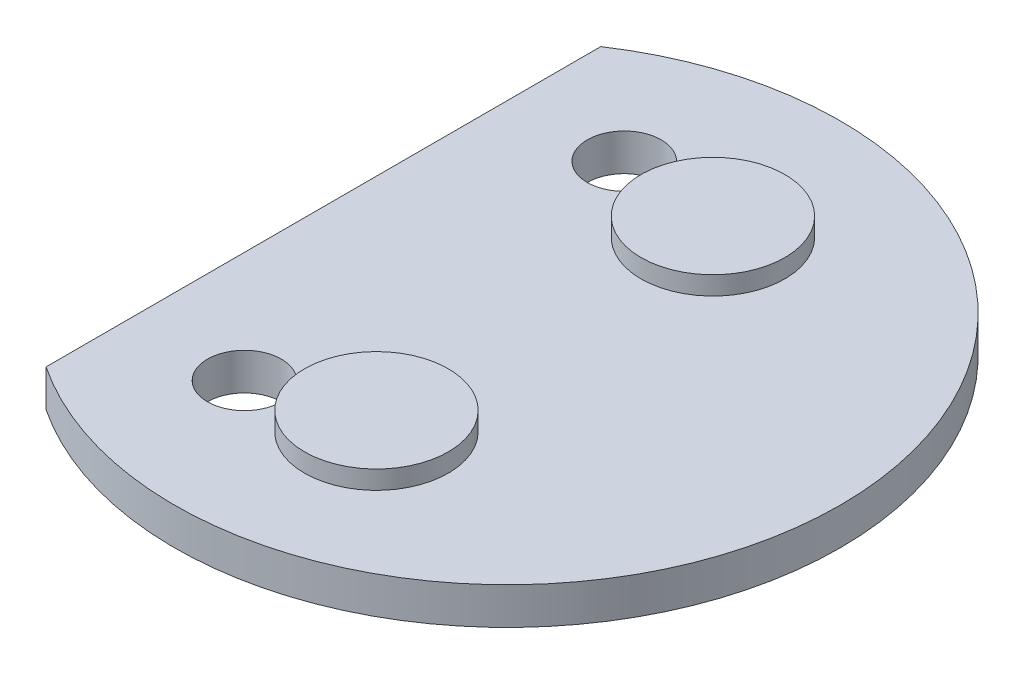
ISO-10303-21;
HEADER;
FILE_DESCRIPTION(('STEP AP214'),'2;1');
FILE_NAME('part.step','',(''),(''),'','','');
FILE_SCHEMA(('AUTOMOTIVE_DESIGN { 1 0 10303 214 1 1 1 1 }'));
ENDSEC;
DATA;
#1=APPLICATION_CONTEXT('core data for automotive mechanical design processes');
#2=APPLICATION_PROTOCOL_DEFINITION('international standard','automotive_design',2000,#1);
#3=PRODUCT_CONTEXT('',#1,'mechanical');
#4=PRODUCT('Part','Part','',(#3));
#5=PRODUCT_RELATED_PRODUCT_CATEGORY('part','',(#4));
#6=PRODUCT_DEFINITION_FORMATION('','',#4);
#7=PRODUCT_DEFINITION_CONTEXT('part definition',#1,'design');
#8=PRODUCT_DEFINITION('design','',#6,#7);
#9=PRODUCT_DEFINITION_SHAPE('','',#8);
#10=(LENGTH_UNIT() NAMED_UNIT(*) SI_UNIT(.MILLI.,.METRE.));
#11=(NAMED_UNIT(*) PLANE_ANGLE_UNIT() SI_UNIT($,.RADIAN.));
#12=(NAMED_UNIT(*) SI_UNIT($,.STERADIAN.) SOLID_ANGLE_UNIT());
#13=UNCERTAINTY_MEASURE_WITH_UNIT(LENGTH_MEASURE(1.E-05),#10,'distance_accuracy_value','');
#14=(GEOMETRIC_REPRESENTATION_CONTEXT(3) GLOBAL_UNCERTAINTY_ASSIGNED_CONTEXT((#13)) GLOBAL_UNIT_ASSIGNED_CONTEXT((#10,
#11,#12)) REPRESENTATION_CONTEXT('',''));
#15=CARTESIAN_POINT('',(0.,0.,0.));
#16=DIRECTION('',(0.,0.,1.));
#17=DIRECTION('',(1.,0.,0.));
#18=AXIS2_PLACEMENT_3D('',#15,#16,#17);
#19=CARTESIAN_POINT('',(4.97012640148231,1.5,0.));
#20=DIRECTION('',(1.,0.,0.));
#21=DIRECTION('',(0.,0.,-1.));
#22=AXIS2_PLACEMENT_3D('',#19,#20,#21);
#23=PLANE('',#22);
#24=DIRECTION('',(0.,0.,1.));
#25=VECTOR('',#24,1.);
#26=CARTESIAN_POINT('',(4.97012640148231,1.,0.));
#27=LINE('',#26,#25);
#28=CARTESIAN_POINT('',(4.97012640148231,1.,-2.06229732519729));
#29=VERTEX_POINT('',#28);
#30=CARTESIAN_POINT('',(4.97012640148231,1.,12.9377026748027));
#31=VERTEX_POINT('',#30);
#32=EDGE_CURVE('E50',#29,#31,#27,.T.);
#33=ORIENTED_EDGE('',*,*,#32,.F.);
#34=DIRECTION('',(0.,-1.,0.));
#35=VECTOR('',#34,1.);
#36=CARTESIAN_POINT('',(4.97012640148231,1.5,-2.06229732519728));
#37=LINE('',#36,#35);
#38=CARTESIAN_POINT('',(4.97012640148231,0.,-2.06229732519728));
#39=VERTEX_POINT('',#38);
#40=EDGE_CURVE('E43',#29,#39,#37,.T.);
#41=ORIENTED_EDGE('',*,*,#40,.T.);
#42=DIRECTION('',(0.,0.,1.));
#43=VECTOR('',#42,1.);
#44=CARTESIAN_POINT('',(4.97012640148231,0.,0.));
#45=LINE('',#44,#43);
#46=CARTESIAN_POINT('',(4.97012640148231,0.,12.9377026748027));
#47=VERTEX_POINT('',#46);
#48=EDGE_CURVE('E75',#39,#47,#45,.T.);
#49=ORIENTED_EDGE('',*,*,#48,.T.);
#50=DIRECTION('',(0.,-1.,0.));
#51=VECTOR('',#50,1.);
#52=CARTESIAN_POINT('',(4.97012640148231,1.5,12.9377026748027));
#53=LINE('',#52,#51);
#54=EDGE_CURVE('E11',#31,#47,#53,.T.);
#55=ORIENTED_EDGE('',*,*,#54,.F.);
#56=EDGE_LOOP('',(#33,#41,#49,#55));
#57=FACE_BOUND('',#56,.T.);
#58=ADVANCED_FACE('F35',(#57),#23,.F.);
#59=CARTESIAN_POINT('',(9.94506358701541,1.5,5.43770267480272));
#60=DIRECTION('',(0.,-1.,0.));
#61=DIRECTION('',(0.,0.,-1.));
#62=AXIS2_PLACEMENT_3D('',#59,#60,#61);
#63=CYLINDRICAL_SURFACE('',#62,9.);
#64=CARTESIAN_POINT('',(9.94506358701541,1.,5.43770267480272));
#65=DIRECTION('',(0.,1.,0.));
#66=DIRECTION('',(0.,0.,1.));
#67=AXIS2_PLACEMENT_3D('',#64,#65,#66);
#68=CIRCLE('',#67,9.);
#69=EDGE_CURVE('E61',#31,#29,#68,.T.);
#70=ORIENTED_EDGE('',*,*,#69,.F.);
#71=ORIENTED_EDGE('',*,*,#54,.T.);
#72=CARTESIAN_POINT('',(9.94506358701541,0.,5.43770267480272));
#73=DIRECTION('',(0.,1.,0.));
#74=DIRECTION('',(0.,0.,1.));
#75=AXIS2_PLACEMENT_3D('',#72,#73,#74);
#76=CIRCLE('',#75,9.);
#77=EDGE_CURVE('E72',#47,#39,#76,.T.);
#78=ORIENTED_EDGE('',*,*,#77,.T.);
#79=ORIENTED_EDGE('',*,*,#40,.F.);
#80=EDGE_LOOP('',(#70,#71,#78,#79));
#81=FACE_BOUND('',#80,.T.);
#82=ADVANCED_FACE('F70',(#81),#63,.T.);
#83=CARTESIAN_POINT('',(0.,0.,0.));
#84=DIRECTION('',(0.,1.,0.));
#85=DIRECTION('',(0.,0.,1.));
#86=AXIS2_PLACEMENT_3D('',#83,#84,#85);
#87=PLANE('',#86);
#88=CARTESIAN_POINT('',(7.97012640148231,0.,0.303015709009733));
#89=DIRECTION('',(0.,1.,0.));
#90=DIRECTION('',(0.,0.,-1.));
#91=AXIS2_PLACEMENT_3D('',#88,#89,#90);
#92=CIRCLE('',#91,1.);
#93=CARTESIAN_POINT('',(7.97012640148231,0.,-0.696984290990268));
#94=VERTEX_POINT('',#93);
#95=EDGE_CURVE('E91',#94,#94,#92,.T.);
#96=ORIENTED_EDGE('',*,*,#95,.T.);
#97=EDGE_LOOP('',(#96));
#98=FACE_BOUND('',#97,.T.);
#99=CARTESIAN_POINT('',(7.97012640148231,0.,10.5723896405957));
#100=DIRECTION('',(0.,1.,0.));
#101=DIRECTION('',(0.,0.,1.));
#102=AXIS2_PLACEMENT_3D('',#99,#100,#101);
#103=CIRCLE('',#102,1.);
#104=CARTESIAN_POINT('',(7.97012640148231,0.,11.5723896405957));
#105=VERTEX_POINT('',#104);
#106=EDGE_CURVE('E81',#105,#105,#103,.T.);
#107=ORIENTED_EDGE('',*,*,#106,.T.);
#108=EDGE_LOOP('',(#107));
#109=FACE_BOUND('',#108,.T.);
#110=ORIENTED_EDGE('',*,*,#48,.F.);
#111=ORIENTED_EDGE('',*,*,#77,.F.);
#112=EDGE_LOOP('',(#110,#111));
#113=FACE_BOUND('',#112,.T.);
#114=ADVANCED_FACE('F101',(#98,#109,#113),#87,.F.);
#115=CARTESIAN_POINT('',(10.9533827269566,1.,0.888525014232755));
#116=DIRECTION('',(0.,1.,0.));
#117=DIRECTION('',(0.,0.,1.));
#118=AXIS2_PLACEMENT_3D('',#115,#116,#117);
#119=CYLINDRICAL_SURFACE('',#118,1.9450496231439);
#120=CARTESIAN_POINT('',(10.9533827269566,1.,0.888525014232755));
#121=DIRECTION('',(0.,1.,0.));
#122=DIRECTION('',(0.,0.,1.));
#123=AXIS2_PLACEMENT_3D('',#120,#121,#122);
#124=CIRCLE('',#123,1.9450496231439);
#125=CARTESIAN_POINT('',(10.9533827269566,1.,2.83357463737666));
#126=VERTEX_POINT('',#125);
#127=EDGE_CURVE('E68',#126,#126,#124,.T.);
#128=ORIENTED_EDGE('',*,*,#127,.T.);
#129=EDGE_LOOP('',(#128));
#130=FACE_BOUND('',#129,.T.);
#131=CARTESIAN_POINT('',(10.9533827269566,1.5,0.888525014232755));
#132=DIRECTION('',(0.,1.,0.));
#133=DIRECTION('',(0.,0.,1.));
#134=AXIS2_PLACEMENT_3D('',#131,#132,#133);
#135=CIRCLE('',#134,1.9450496231439);
#136=CARTESIAN_POINT('',(10.9533827269566,1.5,2.83357463737666));
#137=VERTEX_POINT('',#136);
#138=EDGE_CURVE('E80',#137,#137,#135,.T.);
#139=ORIENTED_EDGE('',*,*,#138,.F.);
#140=EDGE_LOOP('',(#139));
#141=FACE_BOUND('',#140,.T.);
#142=ADVANCED_FACE('F103',(#130,#141),#119,.T.);
#143=CARTESIAN_POINT('',(10.9533827269566,1.,9.98688033537268));
#144=DIRECTION('',(0.,1.,0.));
#145=DIRECTION('',(0.,0.,1.));
#146=AXIS2_PLACEMENT_3D('',#143,#144,#145);
#147=CYLINDRICAL_SURFACE('',#146,1.9450496231439);
#148=CARTESIAN_POINT('',(10.9533827269566,1.,9.98688033537268));
#149=DIRECTION('',(0.,1.,0.));
#150=DIRECTION('',(0.,0.,1.));
#151=AXIS2_PLACEMENT_3D('',#148,#149,#150);
#152=CIRCLE('',#151,1.9450496231439);
#153=CARTESIAN_POINT('',(10.9533827269566,1.,11.9319299585166));
#154=VERTEX_POINT('',#153);
#155=EDGE_CURVE('E96',#154,#154,#152,.F.);
#156=ORIENTED_EDGE('',*,*,#155,.F.);
#157=EDGE_LOOP('',(#156));
#158=FACE_BOUND('',#157,.T.);
#159=CARTESIAN_POINT('',(10.9533827269566,1.5,9.98688033537268));
#160=DIRECTION('',(0.,1.,0.));
#161=DIRECTION('',(0.,0.,1.));
#162=AXIS2_PLACEMENT_3D('',#159,#160,#161);
#163=CIRCLE('',#162,1.9450496231439);
#164=CARTESIAN_POINT('',(10.9533827269566,1.5,11.9319299585166));
#165=VERTEX_POINT('',#164);
#166=EDGE_CURVE('E66',#165,#165,#163,.F.);
#167=ORIENTED_EDGE('',*,*,#166,.T.);
#168=EDGE_LOOP('',(#167));
#169=FACE_BOUND('',#168,.T.);
#170=ADVANCED_FACE('F110',(#158,#169),#147,.T.);
#171=CARTESIAN_POINT('',(0.,1.,0.));
#172=DIRECTION('',(0.,1.,0.));
#173=DIRECTION('',(0.,0.,1.));
#174=AXIS2_PLACEMENT_3D('',#171,#172,#173);
#175=PLANE('',#174);
#176=CARTESIAN_POINT('',(7.97012640148231,1.,0.303015709009733));
#177=DIRECTION('',(0.,1.,0.));
#178=DIRECTION('',(0.,0.,1.));
#179=AXIS2_PLACEMENT_3D('',#176,#177,#178);
#180=CIRCLE('',#179,1.);
#181=CARTESIAN_POINT('',(7.97012640148231,1.,1.30301570900973));
#182=VERTEX_POINT('',#181);
#183=EDGE_CURVE('E38',#182,#182,#180,.T.);
#184=ORIENTED_EDGE('',*,*,#183,.F.);
#185=EDGE_LOOP('',(#184));
#186=FACE_BOUND('',#185,.T.);
#187=CARTESIAN_POINT('',(7.97012640148231,1.,10.5723896405957));
#188=DIRECTION('',(0.,1.,0.));
#189=DIRECTION('',(0.,0.,1.));
#190=AXIS2_PLACEMENT_3D('',#187,#188,#189);
#191=CIRCLE('',#190,1.);
#192=CARTESIAN_POINT('',(7.97012640148231,1.,11.5723896405957));
#193=VERTEX_POINT('',#192);
#194=EDGE_CURVE('E78',#193,#193,#191,.T.);
#195=ORIENTED_EDGE('',*,*,#194,.F.);
#196=EDGE_LOOP('',(#195));
#197=FACE_BOUND('',#196,.T.);
#198=ORIENTED_EDGE('',*,*,#69,.T.);
#199=ORIENTED_EDGE('',*,*,#32,.T.);
#200=EDGE_LOOP('',(#198,#199));
#201=FACE_BOUND('',#200,.T.);
#202=ORIENTED_EDGE('',*,*,#127,.F.);
#203=EDGE_LOOP('',(#202));
#204=FACE_BOUND('',#203,.T.);
#205=ORIENTED_EDGE('',*,*,#155,.T.);
#206=EDGE_LOOP('',(#205));
#207=FACE_BOUND('',#206,.T.);
#208=ADVANCED_FACE('F62',(#186,#197,#201,#204,#207),#175,.T.);
#209=CARTESIAN_POINT('',(0.,1.5,0.));
#210=DIRECTION('',(0.,1.,0.));
#211=DIRECTION('',(0.,0.,1.));
#212=AXIS2_PLACEMENT_3D('',#209,#210,#211);
#213=PLANE('',#212);
#214=ORIENTED_EDGE('',*,*,#138,.T.);
#215=EDGE_LOOP('',(#214));
#216=FACE_BOUND('',#215,.T.);
#217=ADVANCED_FACE('F145',(#216),#213,.T.);
#218=ORIENTED_EDGE('',*,*,#166,.F.);
#219=EDGE_LOOP('',(#218));
#220=FACE_BOUND('',#219,.T.);
#221=ADVANCED_FACE('F149',(#220),#213,.T.);
#222=CARTESIAN_POINT('',(7.97012640148231,0.,10.5723896405957));
#223=DIRECTION('',(0.,1.,0.));
#224=DIRECTION('',(0.,0.,1.));
#225=AXIS2_PLACEMENT_3D('',#222,#223,#224);
#226=CYLINDRICAL_SURFACE('',#225,1.);
#227=ORIENTED_EDGE('',*,*,#194,.T.);
#228=EDGE_LOOP('',(#227));
#229=FACE_BOUND('',#228,.T.);
#230=ORIENTED_EDGE('',*,*,#106,.F.);
#231=EDGE_LOOP('',(#230));
#232=FACE_BOUND('',#231,.T.);
#233=ADVANCED_FACE('F158',(#229,#232),#226,.F.);
#234=CARTESIAN_POINT('',(7.97012640148231,0.,0.303015709009733));
#235=DIRECTION('',(0.,1.,0.));
#236=DIRECTION('',(0.,0.,1.));
#237=AXIS2_PLACEMENT_3D('',#234,#235,#236);
#238=CYLINDRICAL_SURFACE('',#237,1.);
#239=ORIENTED_EDGE('',*,*,#183,.T.);
#240=EDGE_LOOP('',(#239));
#241=FACE_BOUND('',#240,.T.);
#242=ORIENTED_EDGE('',*,*,#95,.F.);
#243=EDGE_LOOP('',(#242));
#244=FACE_BOUND('',#243,.T.);
#245=ADVANCED_FACE('F180',(#241,#244),#238,.F.);
#246=CLOSED_SHELL('',(#58,#82,#114,#142,#170,#208,#217,#221,#233,#245));
#247=MANIFOLD_SOLID_BREP('B2',#246);
#248=ADVANCED_BREP_SHAPE_REPRESENTATION('',(#18,#247),#14);
#249=SHAPE_DEFINITION_REPRESENTATION(#9,#248);
ENDSEC;
END-ISO-10303-21;
